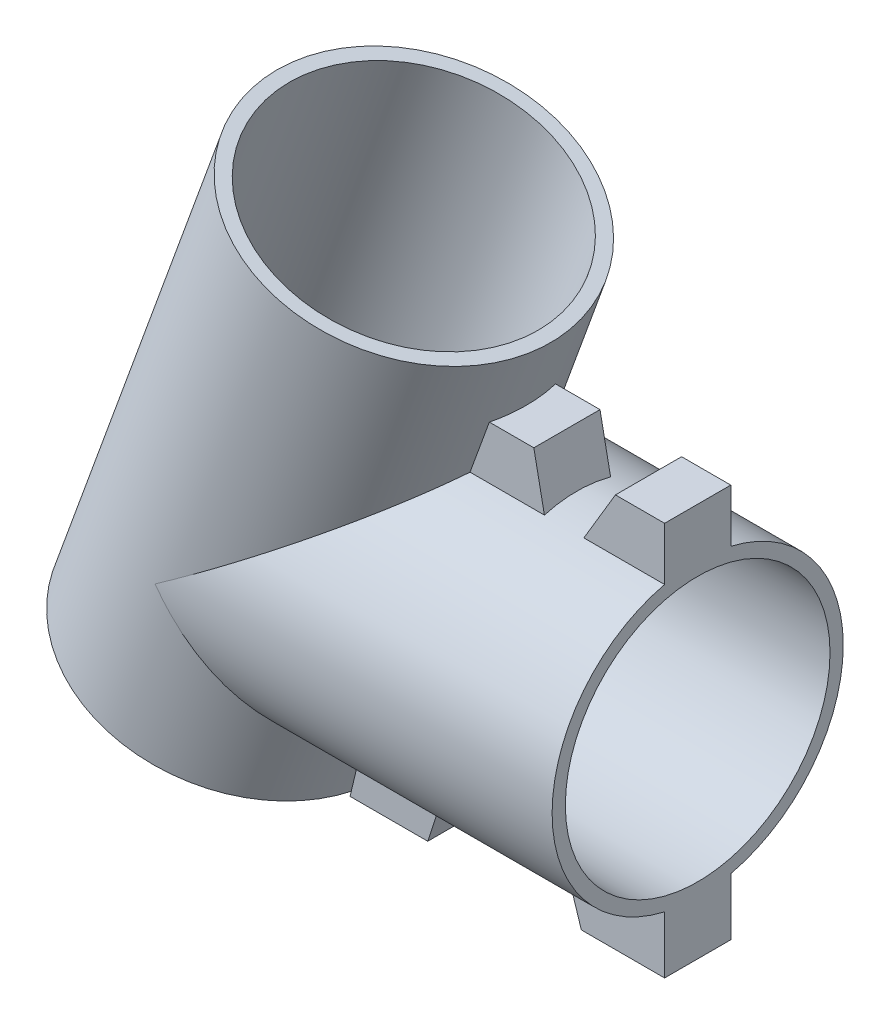
ISO-10303-21;
HEADER;
FILE_DESCRIPTION(('STEP AP214'),'2;1');
FILE_NAME('part.step','',(''),(''),'','','');
FILE_SCHEMA(('AUTOMOTIVE_DESIGN { 1 0 10303 214 1 1 1 1 }'));
ENDSEC;
DATA;
#1=APPLICATION_CONTEXT('core data for automotive mechanical design processes');
#2=APPLICATION_PROTOCOL_DEFINITION('international standard','automotive_design',2000,#1);
#3=PRODUCT_CONTEXT('',#1,'mechanical');
#4=PRODUCT('Part','Part','',(#3));
#5=PRODUCT_RELATED_PRODUCT_CATEGORY('part','',(#4));
#6=PRODUCT_DEFINITION_FORMATION('','',#4);
#7=PRODUCT_DEFINITION_CONTEXT('part definition',#1,'design');
#8=PRODUCT_DEFINITION('design','',#6,#7);
#9=PRODUCT_DEFINITION_SHAPE('','',#8);
#10=(LENGTH_UNIT() NAMED_UNIT(*) SI_UNIT(.MILLI.,.METRE.));
#11=(NAMED_UNIT(*) PLANE_ANGLE_UNIT() SI_UNIT($,.RADIAN.));
#12=(NAMED_UNIT(*) SI_UNIT($,.STERADIAN.) SOLID_ANGLE_UNIT());
#13=UNCERTAINTY_MEASURE_WITH_UNIT(LENGTH_MEASURE(1.E-05),#10,'distance_accuracy_value','');
#14=(GEOMETRIC_REPRESENTATION_CONTEXT(3) GLOBAL_UNCERTAINTY_ASSIGNED_CONTEXT((#13)) GLOBAL_UNIT_ASSIGNED_CONTEXT((#10,
#11,#12)) REPRESENTATION_CONTEXT('',''));
#15=CARTESIAN_POINT('',(0.,0.,0.));
#16=DIRECTION('',(0.,0.,1.));
#17=DIRECTION('',(1.,0.,0.));
#18=AXIS2_PLACEMENT_3D('',#15,#16,#17);
#19=CARTESIAN_POINT('',(30.,0.,0.));
#20=DIRECTION('',(-1.,0.,0.));
#21=DIRECTION('',(0.,0.,1.));
#22=AXIS2_PLACEMENT_3D('',#19,#20,#21);
#23=CYLINDRICAL_SURFACE('',#22,11.);
#24=DIRECTION('',(-1.,0.,0.));
#25=VECTOR('',#24,1.);
#26=CARTESIAN_POINT('',(30.,-10.7121426428143,2.5));
#27=LINE('',#26,#25);
#28=CARTESIAN_POINT('',(13.5093890982505,-10.7121426428143,2.5));
#29=VERTEX_POINT('',#28);
#30=CARTESIAN_POINT('',(7.50072302887626,-10.7121426428143,2.5));
#31=VERTEX_POINT('',#30);
#32=EDGE_CURVE('E58',#29,#31,#27,.T.);
#33=ORIENTED_EDGE('',*,*,#32,.F.);
#34=CARTESIAN_POINT('',(16.9885978400791,0.,0.));
#35=DIRECTION('',(-0.95109245105899,0.308906376655779,0.));
#36=DIRECTION('',(-0.308906376655779,-0.95109245105899,0.));
#37=AXIS2_PLACEMENT_3D('',#34,#35,#36);
#38=ELLIPSE('',#37,11.5656474696567,11.);
#39=CARTESIAN_POINT('',(13.5093890982505,-10.7121426428143,-2.5));
#40=VERTEX_POINT('',#39);
#41=EDGE_CURVE('E44',#40,#29,#38,.T.);
#42=ORIENTED_EDGE('',*,*,#41,.F.);
#43=DIRECTION('',(-1.,0.,0.));
#44=VECTOR('',#43,1.);
#45=CARTESIAN_POINT('',(30.,-10.7121426428143,-2.5));
#46=LINE('',#45,#44);
#47=CARTESIAN_POINT('',(7.50072302887626,-10.7121426428143,-2.5));
#48=VERTEX_POINT('',#47);
#49=EDGE_CURVE('E203',#40,#48,#46,.T.);
#50=ORIENTED_EDGE('',*,*,#49,.T.);
#51=CARTESIAN_POINT('',(0.,0.,0.));
#52=DIRECTION('',(-0.819152044288991,-0.573576436351047,0.));
#53=DIRECTION('',(-0.573576436351047,0.819152044288991,0.));
#54=AXIS2_PLACEMENT_3D('',#51,#52,#53);
#55=ELLIPSE('',#54,13.428520476376,11.);
#56=CARTESIAN_POINT('',(0.,0.,-11.));
#57=VERTEX_POINT('',#56);
#58=EDGE_CURVE('E263',#48,#57,#55,.F.);
#59=ORIENTED_EDGE('',*,*,#58,.T.);
#60=CARTESIAN_POINT('',(0.,0.,0.));
#61=DIRECTION('',(-0.573576436351047,0.819152044288991,0.));
#62=DIRECTION('',(-0.819152044288991,-0.573576436351047,0.));
#63=AXIS2_PLACEMENT_3D('',#60,#61,#62);
#64=ELLIPSE('',#63,19.177914751832,11.);
#65=CARTESIAN_POINT('',(15.2985251632724,10.7121426428143,-2.5));
#66=VERTEX_POINT('',#65);
#67=EDGE_CURVE('E267',#57,#66,#64,.F.);
#68=ORIENTED_EDGE('',*,*,#67,.T.);
#69=DIRECTION('',(-1.,0.,0.));
#70=VECTOR('',#69,1.);
#71=CARTESIAN_POINT('',(30.,10.7121426428143,-2.5));
#72=LINE('',#71,#70);
#73=CARTESIAN_POINT('',(20.9193501262579,10.7121426428143,-2.5));
#74=VERTEX_POINT('',#73);
#75=EDGE_CURVE('E244',#66,#74,#72,.F.);
#76=ORIENTED_EDGE('',*,*,#75,.T.);
#77=CARTESIAN_POINT('',(23.0578554697756,0.,0.));
#78=DIRECTION('',(-0.980649682263221,-0.195770786066369,0.));
#79=DIRECTION('',(-0.195770786066369,0.980649682263221,0.));
#80=AXIS2_PLACEMENT_3D('',#77,#78,#79);
#81=ELLIPSE('',#80,11.2170535502682,11.);
#82=CARTESIAN_POINT('',(20.9193501262579,10.7121426428143,2.5));
#83=VERTEX_POINT('',#82);
#84=EDGE_CURVE('E402',#83,#74,#81,.T.);
#85=ORIENTED_EDGE('',*,*,#84,.F.);
#86=DIRECTION('',(-1.,0.,0.));
#87=VECTOR('',#86,1.);
#88=CARTESIAN_POINT('',(30.,10.7121426428143,2.5));
#89=LINE('',#88,#87);
#90=CARTESIAN_POINT('',(15.2985251632724,10.7121426428143,2.5));
#91=VERTEX_POINT('',#90);
#92=EDGE_CURVE('E247',#91,#83,#89,.F.);
#93=ORIENTED_EDGE('',*,*,#92,.F.);
#94=CARTESIAN_POINT('',(0.,0.,11.));
#95=VERTEX_POINT('',#94);
#96=EDGE_CURVE('E266',#91,#95,#64,.F.);
#97=ORIENTED_EDGE('',*,*,#96,.T.);
#98=EDGE_CURVE('E264',#95,#31,#55,.F.);
#99=ORIENTED_EDGE('',*,*,#98,.T.);
#100=EDGE_LOOP('',(#33,#42,#50,#59,#68,#76,#85,#93,#97,#99));
#101=FACE_BOUND('',#100,.T.);
#102=CARTESIAN_POINT('',(30.,-10.7121426428143,2.5));
#103=VERTEX_POINT('',#102);
#104=CARTESIAN_POINT('',(22.3216688543815,-10.7121426428143,2.5));
#105=VERTEX_POINT('',#104);
#106=EDGE_CURVE('E210',#103,#105,#27,.T.);
#107=ORIENTED_EDGE('',*,*,#106,.F.);
#108=CARTESIAN_POINT('',(30.,0.,0.));
#109=DIRECTION('',(1.,0.,0.));
#110=DIRECTION('',(0.,0.,-1.));
#111=AXIS2_PLACEMENT_3D('',#108,#109,#110);
#112=CIRCLE('',#111,11.);
#113=CARTESIAN_POINT('',(30.,10.7121426428143,2.5));
#114=VERTEX_POINT('',#113);
#115=EDGE_CURVE('E174',#114,#103,#112,.T.);
#116=ORIENTED_EDGE('',*,*,#115,.F.);
#117=CARTESIAN_POINT('',(23.9000041159506,10.7121426428143,2.5));
#118=VERTEX_POINT('',#117);
#119=EDGE_CURVE('E250',#118,#114,#89,.F.);
#120=ORIENTED_EDGE('',*,*,#119,.F.);
#121=CARTESIAN_POINT('',(17.5236119602663,0.,0.));
#122=DIRECTION('',(0.859288767403495,-0.511490776274786,0.));
#123=DIRECTION('',(-0.511490776274786,-0.859288767403495,0.));
#124=AXIS2_PLACEMENT_3D('',#121,#122,#123);
#125=ELLIPSE('',#124,12.8012845242218,11.);
#126=CARTESIAN_POINT('',(23.9000041159506,10.7121426428143,-2.5));
#127=VERTEX_POINT('',#126);
#128=EDGE_CURVE('E592',#127,#118,#125,.T.);
#129=ORIENTED_EDGE('',*,*,#128,.F.);
#130=CARTESIAN_POINT('',(30.,10.7121426428143,-2.5));
#131=VERTEX_POINT('',#130);
#132=EDGE_CURVE('E246',#127,#131,#72,.F.);
#133=ORIENTED_EDGE('',*,*,#132,.T.);
#134=CARTESIAN_POINT('',(30.,-10.7121426428143,-2.5));
#135=VERTEX_POINT('',#134);
#136=EDGE_CURVE('E273',#135,#131,#112,.T.);
#137=ORIENTED_EDGE('',*,*,#136,.F.);
#138=CARTESIAN_POINT('',(22.3216688543815,-10.7121426428143,-2.5));
#139=VERTEX_POINT('',#138);
#140=EDGE_CURVE('E206',#135,#139,#46,.T.);
#141=ORIENTED_EDGE('',*,*,#140,.T.);
#142=CARTESIAN_POINT('',(18.8846964170532,0.,0.));
#143=DIRECTION('',(0.952189405602947,0.305508323712312,0.));
#144=DIRECTION('',(-0.305508323712312,0.952189405602947,0.));
#145=AXIS2_PLACEMENT_3D('',#142,#143,#144);
#146=ELLIPSE('',#145,11.5523234508523,11.);
#147=EDGE_CURVE('E11',#105,#139,#146,.T.);
#148=ORIENTED_EDGE('',*,*,#147,.F.);
#149=EDGE_LOOP('',(#107,#116,#120,#129,#133,#137,#141,#148));
#150=FACE_BOUND('',#149,.T.);
#151=ADVANCED_FACE('F37',(#101,#150),#23,.T.);
#152=CARTESIAN_POINT('',(-4.10424171990799,-11.2763114494309,0.));
#153=DIRECTION('',(0.342020143325666,0.939692620785909,0.));
#154=DIRECTION('',(-0.939692620785909,0.342020143325666,0.));
#155=AXIS2_PLACEMENT_3D('',#152,#153,#154);
#156=CYLINDRICAL_SURFACE('',#155,11.);
#157=CARTESIAN_POINT('',(8.55050358314165,23.4923155196477,0.));
#158=DIRECTION('',(0.342020143325666,0.93969262078591,0.));
#159=DIRECTION('',(-0.939692620785909,0.342020143325666,0.));
#160=AXIS2_PLACEMENT_3D('',#157,#158,#159);
#161=CIRCLE('',#160,11.);
#162=CARTESIAN_POINT('',(-1.78611524550335,27.2545370962301,0.));
#163=VERTEX_POINT('',#162);
#164=EDGE_CURVE('E254',#163,#163,#161,.T.);
#165=ORIENTED_EDGE('',*,*,#164,.F.);
#166=EDGE_LOOP('',(#165));
#167=FACE_BOUND('',#166,.T.);
#168=CARTESIAN_POINT('',(28.7641194466169,79.0287686700761,0.));
#169=DIRECTION('',(0.972491393226406,-0.232938811923996,0.));
#170=DIRECTION('',(0.232938811923996,0.972491393226406,0.));
#171=AXIS2_PLACEMENT_3D('',#168,#169,#170);
#172=ELLIPSE('',#171,96.7281585742419,11.);
#173=CARTESIAN_POINT('',(6.23237710873701,-15.0385330260132,0.));
#174=VERTEX_POINT('',#173);
#175=CARTESIAN_POINT('',(6.82200690893445,-12.5768998565743,2.5));
#176=VERTEX_POINT('',#175);
#177=EDGE_CURVE('E190',#174,#176,#172,.F.);
#178=ORIENTED_EDGE('',*,*,#177,.T.);
#179=DIRECTION('',(0.342020143325666,0.939692620785909,0.));
#180=VECTOR('',#179,1.);
#181=CARTESIAN_POINT('',(5.96187967435065,-14.9400800114512,2.5));
#182=LINE('',#181,#180);
#183=EDGE_CURVE('E207',#176,#31,#182,.T.);
#184=ORIENTED_EDGE('',*,*,#183,.T.);
#185=ORIENTED_EDGE('',*,*,#98,.F.);
#186=ORIENTED_EDGE('',*,*,#96,.F.);
#187=DIRECTION('',(0.342020143325666,0.939692620785909,0.));
#188=VECTOR('',#187,1.);
#189=CARTESIAN_POINT('',(5.96187967435065,-14.9400800114512,2.5));
#190=LINE('',#189,#188);
#191=CARTESIAN_POINT('',(16.7565186227532,14.7179467504503,2.5));
#192=VERTEX_POINT('',#191);
#193=EDGE_CURVE('E594',#91,#192,#190,.T.);
#194=ORIENTED_EDGE('',*,*,#193,.T.);
#195=CARTESIAN_POINT('',(5.35689452667886,14.7179467504503,0.));
#196=DIRECTION('',(0.,-1.,0.));
#197=DIRECTION('',(1.,0.,0.));
#198=AXIS2_PLACEMENT_3D('',#195,#196,#197);
#199=ELLIPSE('',#198,11.705955497235,11.);
#200=CARTESIAN_POINT('',(16.7565186227532,14.7179467504503,-2.5));
#201=VERTEX_POINT('',#200);
#202=EDGE_CURVE('E597',#192,#201,#199,.F.);
#203=ORIENTED_EDGE('',*,*,#202,.T.);
#204=DIRECTION('',(0.342020143325666,0.939692620785909,0.));
#205=VECTOR('',#204,1.);
#206=CARTESIAN_POINT('',(5.96187967435065,-14.9400800114512,-2.5));
#207=LINE('',#206,#205);
#208=EDGE_CURVE('E282',#66,#201,#207,.T.);
#209=ORIENTED_EDGE('',*,*,#208,.F.);
#210=ORIENTED_EDGE('',*,*,#67,.F.);
#211=ORIENTED_EDGE('',*,*,#58,.F.);
#212=DIRECTION('',(0.342020143325666,0.939692620785909,0.));
#213=VECTOR('',#212,1.);
#214=CARTESIAN_POINT('',(5.96187967435065,-14.9400800114512,-2.5));
#215=LINE('',#214,#213);
#216=CARTESIAN_POINT('',(6.82200690893445,-12.5768998565743,-2.5));
#217=VERTEX_POINT('',#216);
#218=EDGE_CURVE('E200',#217,#48,#215,.T.);
#219=ORIENTED_EDGE('',*,*,#218,.F.);
#220=EDGE_CURVE('E193',#217,#174,#172,.F.);
#221=ORIENTED_EDGE('',*,*,#220,.T.);
#222=CARTESIAN_POINT('',(-4.10424171990799,-11.2763114494309,0.));
#223=DIRECTION('',(0.342020143325666,0.93969262078591,0.));
#224=DIRECTION('',(-0.939692620785909,0.342020143325666,0.));
#225=AXIS2_PLACEMENT_3D('',#222,#223,#224);
#226=CIRCLE('',#225,11.);
#227=EDGE_CURVE('E260',#174,#174,#226,.T.);
#228=ORIENTED_EDGE('',*,*,#227,.T.);
#229=EDGE_LOOP('',(#178,#184,#185,#186,#194,#203,#209,#210,#211,#219,#221,#228));
#230=FACE_BOUND('',#229,.T.);
#231=ADVANCED_FACE('F292',(#167,#230),#156,.T.);
#232=CARTESIAN_POINT('',(30.,0.,0.));
#233=DIRECTION('',(1.,0.,0.));
#234=DIRECTION('',(0.,0.,-1.));
#235=AXIS2_PLACEMENT_3D('',#232,#233,#234);
#236=PLANE('',#235);
#237=ORIENTED_EDGE('',*,*,#115,.T.);
#238=DIRECTION('',(0.,1.,0.));
#239=VECTOR('',#238,1.);
#240=CARTESIAN_POINT('',(30.,-15.0385330260132,2.5));
#241=LINE('',#240,#239);
#242=CARTESIAN_POINT('',(30.,-15.0385330260132,2.5));
#243=VERTEX_POINT('',#242);
#244=EDGE_CURVE('E164',#243,#103,#241,.T.);
#245=ORIENTED_EDGE('',*,*,#244,.F.);
#246=DIRECTION('',(0.,0.,-1.));
#247=VECTOR('',#246,1.);
#248=CARTESIAN_POINT('',(30.,-15.0385330260132,2.5));
#249=LINE('',#248,#247);
#250=CARTESIAN_POINT('',(30.,-15.0385330260132,-2.5));
#251=VERTEX_POINT('',#250);
#252=EDGE_CURVE('E170',#243,#251,#249,.T.);
#253=ORIENTED_EDGE('',*,*,#252,.T.);
#254=DIRECTION('',(0.,1.,0.));
#255=VECTOR('',#254,1.);
#256=CARTESIAN_POINT('',(30.,-15.0385330260132,-2.5));
#257=LINE('',#256,#255);
#258=EDGE_CURVE('E379',#251,#135,#257,.T.);
#259=ORIENTED_EDGE('',*,*,#258,.T.);
#260=ORIENTED_EDGE('',*,*,#136,.T.);
#261=DIRECTION('',(0.,1.,0.));
#262=VECTOR('',#261,1.);
#263=CARTESIAN_POINT('',(30.,10.2376867624351,-2.5));
#264=LINE('',#263,#262);
#265=CARTESIAN_POINT('',(30.,14.7179467504503,-2.5));
#266=VERTEX_POINT('',#265);
#267=EDGE_CURVE('E228',#131,#266,#264,.T.);
#268=ORIENTED_EDGE('',*,*,#267,.T.);
#269=DIRECTION('',(0.,0.,-1.));
#270=VECTOR('',#269,1.);
#271=CARTESIAN_POINT('',(30.,14.7179467504503,2.5));
#272=LINE('',#271,#270);
#273=CARTESIAN_POINT('',(30.,14.7179467504503,2.5));
#274=VERTEX_POINT('',#273);
#275=EDGE_CURVE('E241',#274,#266,#272,.T.);
#276=ORIENTED_EDGE('',*,*,#275,.F.);
#277=DIRECTION('',(0.,1.,0.));
#278=VECTOR('',#277,1.);
#279=CARTESIAN_POINT('',(30.,10.2376867624351,2.5));
#280=LINE('',#279,#278);
#281=EDGE_CURVE('E214',#114,#274,#280,.T.);
#282=ORIENTED_EDGE('',*,*,#281,.F.);
#283=EDGE_LOOP('',(#237,#245,#253,#259,#260,#268,#276,#282));
#284=FACE_BOUND('',#283,.T.);
#285=CARTESIAN_POINT('',(30.,0.,0.));
#286=DIRECTION('',(1.,0.,0.));
#287=DIRECTION('',(0.,0.,-1.));
#288=AXIS2_PLACEMENT_3D('',#285,#286,#287);
#289=CIRCLE('',#288,10.);
#290=CARTESIAN_POINT('',(30.,0.,-10.));
#291=VERTEX_POINT('',#290);
#292=EDGE_CURVE('E270',#291,#291,#289,.T.);
#293=ORIENTED_EDGE('',*,*,#292,.F.);
#294=EDGE_LOOP('',(#293));
#295=FACE_BOUND('',#294,.T.);
#296=ADVANCED_FACE('F166',(#284,#295),#236,.T.);
#297=CARTESIAN_POINT('',(30.,0.,0.));
#298=DIRECTION('',(-1.,0.,0.));
#299=DIRECTION('',(0.,0.,1.));
#300=AXIS2_PLACEMENT_3D('',#297,#298,#299);
#301=CYLINDRICAL_SURFACE('',#300,10.);
#302=CARTESIAN_POINT('',(4.87667519526036,0.,10.));
#303=CARTESIAN_POINT('',(4.83316749520878,-0.119543414479836,9.99999944236174));
#304=CARTESIAN_POINT('',(4.79405552958466,-0.240720496418783,9.99785325621343));
#305=CARTESIAN_POINT('',(4.7255083582746,-0.485622488901579,9.98895303871183));
#306=CARTESIAN_POINT('',(4.69607332214629,-0.6093474440485,9.98219892662556));
#307=CARTESIAN_POINT('',(4.64731589580286,-0.858508946869633,9.96386328162467));
#308=CARTESIAN_POINT('',(4.6279998645241,-0.983946520105342,9.95227872137442));
#309=CARTESIAN_POINT('',(4.59945419885167,-1.2354005000026,9.92420232544032));
#310=CARTESIAN_POINT('',(4.5902240350544,-1.3614168759343,9.90771074738191));
#311=CARTESIAN_POINT('',(4.58132682447828,-1.61221249391166,9.86999207908324));
#312=CARTESIAN_POINT('',(4.58159724826965,-1.73699442007543,9.84879686450751));
#313=CARTESIAN_POINT('',(4.59065297721359,-1.98538338619193,9.80174774597156));
#314=CARTESIAN_POINT('',(4.5994418555438,-2.10898991113552,9.77589189074931));
#315=CARTESIAN_POINT('',(4.63699999950057,-2.47733167826657,9.69155398531685));
#316=CARTESIAN_POINT('',(4.67696391813376,-2.71942310984607,9.62632673572664));
#317=CARTESIAN_POINT('',(4.77484148476767,-3.17915494608304,9.48406272461954));
#318=CARTESIAN_POINT('',(4.83150628385426,-3.39738486862002,9.40799356721854));
#319=CARTESIAN_POINT('',(4.95753485645188,-3.82502630582167,9.24238918508279));
#320=CARTESIAN_POINT('',(5.02690876790143,-4.03443061516813,9.1528432202769));
#321=CARTESIAN_POINT('',(5.17412555509535,-4.44485414053646,8.96073540410827));
#322=CARTESIAN_POINT('',(5.25199285618755,-4.6458467437159,8.85813586445524));
#323=CARTESIAN_POINT('',(5.41273305845969,-5.03887158783448,8.64061354355422));
#324=CARTESIAN_POINT('',(5.4956051171295,-5.23090532733102,8.52569283396324));
#325=CARTESIAN_POINT('',(5.69229705549218,-5.66940422313144,8.2429962067872));
#326=CARTESIAN_POINT('',(5.8071239301561,-5.91237140751139,8.07047011216848));
#327=CARTESIAN_POINT('',(6.03688835867747,-6.38200235877704,7.70445853136223));
#328=CARTESIAN_POINT('',(6.15182593433127,-6.6086616088184,7.51096727531109));
#329=CARTESIAN_POINT('',(6.37831302574934,-7.04454779267764,7.10374699178558));
#330=CARTESIAN_POINT('',(6.48986482680862,-7.25378665883785,6.89003203481585));
#331=CARTESIAN_POINT('',(6.70681682006805,-7.65363386246784,6.44296513052916));
#332=CARTESIAN_POINT('',(6.81221771817163,-7.84424433951038,6.20961544411146));
#333=CARTESIAN_POINT('',(7.01414578594415,-8.20473610696584,5.72479812633705));
#334=CARTESIAN_POINT('',(7.11069433710864,-8.37466768769844,5.47337691555381));
#335=CARTESIAN_POINT('',(7.29297208871077,-8.69245781893609,4.95318660937712));
#336=CARTESIAN_POINT('',(7.37870079218014,-8.84031535561145,4.68441671799481));
#337=CARTESIAN_POINT('',(7.53720384608787,-9.1118010531444,4.13156402987184));
#338=CARTESIAN_POINT('',(7.60999030247181,-9.23545186758723,3.8474958704395));
#339=CARTESIAN_POINT('',(7.74086070798402,-9.45669231671084,3.26613511635948));
#340=CARTESIAN_POINT('',(7.79894769906281,-9.55428734368313,2.96884527284264));
#341=CARTESIAN_POINT('',(7.89195221910182,-9.71004578548007,2.4058502110774));
#342=CARTESIAN_POINT('',(7.92896532000317,-9.77179985858523,2.14147924834269));
#343=CARTESIAN_POINT('',(7.99018006804206,-9.87375303971008,1.60715401269033));
#344=CARTESIAN_POINT('',(8.01438296638424,-9.91395425285663,1.33720028773227));
#345=CARTESIAN_POINT('',(8.04944501661138,-9.97214827367639,0.794213875138749));
#346=CARTESIAN_POINT('',(8.06031219586332,-9.9901544415712,0.521183139689972));
#347=CARTESIAN_POINT('',(8.06848887230162,-10.0037053435342,-0.0256320364093605));
#348=CARTESIAN_POINT('',(8.06579930847051,-9.99925163324388,-0.299416423546852));
#349=CARTESIAN_POINT('',(8.04795281287952,-9.96966413626494,-0.81560595936874));
#350=CARTESIAN_POINT('',(8.0341792002112,-9.94682482229167,-1.05819495617296));
#351=CARTESIAN_POINT('',(7.9961513081791,-9.88365843105345,-1.54025341526282));
#352=CARTESIAN_POINT('',(7.97189712958732,-9.84333152193398,-1.7797229075201));
#353=CARTESIAN_POINT('',(7.91332265996645,-9.74569503926927,-2.25389065694767));
#354=CARTESIAN_POINT('',(7.87900309212334,-9.68838668581713,-2.48858925560586));
#355=CARTESIAN_POINT('',(7.80086114211625,-9.55745728580428,-2.95176825290875));
#356=CARTESIAN_POINT('',(7.75703838781745,-9.48383560042812,-3.18024840765125));
#357=CARTESIAN_POINT('',(7.65992089752519,-9.31996283219667,-3.63276673495536));
#358=CARTESIAN_POINT('',(7.6065045717119,-9.22949765850341,-3.85670110581493));
#359=CARTESIAN_POINT('',(7.4914468915715,-9.0335407528586,-4.29568676432234));
#360=CARTESIAN_POINT('',(7.42980554163199,-8.92804902892291,-4.51073805670874));
#361=CARTESIAN_POINT('',(7.29921857788456,-8.70299709890104,-4.93098914051781));
#362=CARTESIAN_POINT('',(7.23027373548979,-8.58343837845891,-5.13618996905079));
#363=CARTESIAN_POINT('',(7.08603258768695,-8.33112825795807,-5.53608418033447));
#364=CARTESIAN_POINT('',(7.01073354719623,-8.19837117240866,-5.73077297858102));
#365=CARTESIAN_POINT('',(6.8461468477476,-7.90505624262527,-6.13010023039348));
#366=CARTESIAN_POINT('',(6.75623636897276,-7.74304958798562,-6.33341845518862));
#367=CARTESIAN_POINT('',(6.57149645177471,-7.4050242784705,-6.72551940879143));
#368=CARTESIAN_POINT('',(6.47666834381044,-7.22900940668271,-6.91430603512141));
#369=CARTESIAN_POINT('',(6.28366627654224,-6.86357768876705,-7.27720513115459));
#370=CARTESIAN_POINT('',(6.18548756159111,-6.67414134493503,-7.45129541243314));
#371=CARTESIAN_POINT('',(5.98793962344832,-6.28282842676995,-7.78408887335719));
#372=CARTESIAN_POINT('',(5.88857052457928,-6.08095314257933,-7.9427936443785));
#373=CARTESIAN_POINT('',(5.69625867532129,-5.676111946313,-8.23656362901949));
#374=CARTESIAN_POINT('',(5.60325229752454,-5.47375898651227,-8.37243226240736));
#375=CARTESIAN_POINT('',(5.42097048323743,-5.05837041569198,-8.62975142880545));
#376=CARTESIAN_POINT('',(5.33169606823839,-4.84533191453726,-8.75119803082853));
#377=CARTESIAN_POINT('',(5.16055270777289,-4.40889815735382,-8.97898036652645));
#378=CARTESIAN_POINT('',(5.07867188794658,-4.18552041199389,-9.08534049229919));
#379=CARTESIAN_POINT('',(4.92704628297102,-3.72816437743075,-9.28239189368151));
#380=CARTESIAN_POINT('',(4.85729203292856,-3.49419453687474,-9.37309538903134));
#381=CARTESIAN_POINT('',(4.7309425334066,-2.99324962864942,-9.54550862040833));
#382=CARTESIAN_POINT('',(4.67615795659224,-2.72522215640284,-9.6256136837959));
#383=CARTESIAN_POINT('',(4.61962558525415,-2.31576935558073,-9.72918467650099));
#384=CARTESIAN_POINT('',(4.60505706637309,-2.17817002626169,-9.76092393671849));
#385=CARTESIAN_POINT('',(4.58601123278741,-1.90110753584195,-9.81864435796924));
#386=CARTESIAN_POINT('',(4.58152830027639,-1.76164545589105,-9.84462871728319));
#387=CARTESIAN_POINT('',(4.58405347343605,-1.47981389346111,-9.89094690840658));
#388=CARTESIAN_POINT('',(4.59122635518891,-1.33743131091165,-9.91119487858017));
#389=CARTESIAN_POINT('',(4.61834788437797,-1.05312714367192,-9.94542190971155));
#390=CARTESIAN_POINT('',(4.63829496450486,-0.911205504573671,-9.95940173937085));
#391=CARTESIAN_POINT('',(4.69116888951949,-0.629321295230561,-9.98117942515595));
#392=CARTESIAN_POINT('',(4.72409572849692,-0.489358724093676,-9.98897728409668));
#393=CARTESIAN_POINT('',(4.80229302018354,-0.212721790754963,-9.99869599120282));
#394=CARTESIAN_POINT('',(4.84756560179126,-0.0760480000976094,-10.0006158250634));
#395=CARTESIAN_POINT('',(4.95665582866065,0.212891047178269,-9.99892588973534));
#396=CARTESIAN_POINT('',(5.02222290803176,0.364487293132292,-9.99445990968539));
#397=CARTESIAN_POINT('',(5.16550840372863,0.661562345631603,-9.97920330471339));
#398=CARTESIAN_POINT('',(5.24323714476361,0.807035819818395,-9.96840728427483));
#399=CARTESIAN_POINT('',(5.40865203595864,1.09230734447774,-9.94120084473515));
#400=CARTESIAN_POINT('',(5.49637332945504,1.23208286038709,-9.92477017456132));
#401=CARTESIAN_POINT('',(5.67937410834876,1.50580322593928,-9.88694302210723));
#402=CARTESIAN_POINT('',(5.77465213680344,1.63974919184712,-9.8655474955295));
#403=CARTESIAN_POINT('',(5.97570503174987,1.9086822884318,-9.81715238984137));
#404=CARTESIAN_POINT('',(6.08176352481137,2.04341667651181,-9.78993489729165));
#405=CARTESIAN_POINT('',(6.29875011243021,2.30790262344876,-9.73097748771188));
#406=CARTESIAN_POINT('',(6.40967945335468,2.43765289084213,-9.69923640845183));
#407=CARTESIAN_POINT('',(6.74808140212022,2.82060507698499,-9.5976123753541));
#408=CARTESIAN_POINT('',(6.98101219085067,3.0673072141227,-9.52136611154372));
#409=CARTESIAN_POINT('',(7.45516384002089,3.54778596906169,-9.35296942567859));
#410=CARTESIAN_POINT('',(7.69640098464392,3.78153454183,-9.26078614938611));
#411=CARTESIAN_POINT('',(8.18252645749105,4.23808875716584,-9.06093981172418));
#412=CARTESIAN_POINT('',(8.42741304698861,4.4608994065522,-8.9532839232546));
#413=CARTESIAN_POINT('',(8.96718928925182,4.94102048710153,-8.69909171685653));
#414=CARTESIAN_POINT('',(9.26226277597546,5.19629417837842,-8.5490874244721));
#415=CARTESIAN_POINT('',(9.8497154559586,5.69488036991346,-8.22536687170632));
#416=CARTESIAN_POINT('',(10.14209375185,5.93818899551647,-8.05164299808283));
#417=CARTESIAN_POINT('',(10.7198008405999,6.41227528210822,-7.67941013367518));
#418=CARTESIAN_POINT('',(11.0051446778921,6.64308123340612,-7.48096076615318));
#419=CARTESIAN_POINT('',(11.5656519306014,7.09178312013525,-7.05704120161539));
#420=CARTESIAN_POINT('',(11.840820155028,7.30968518401922,-6.83158398777282));
#421=CARTESIAN_POINT('',(12.2796244735424,7.65446010882893,-6.43822249147821));
#422=CARTESIAN_POINT('',(12.4475992582308,7.78574844099611,-6.27900089127535));
#423=CARTESIAN_POINT('',(12.7762261625311,8.04151213691162,-5.94792932866374));
#424=CARTESIAN_POINT('',(12.9368776640329,8.16598692575109,-5.77607830347443));
#425=CARTESIAN_POINT('',(13.2491283816388,8.40706367133549,-5.41918828278914));
#426=CARTESIAN_POINT('',(13.4007308949242,8.52366849770965,-5.23415414540337));
#427=CARTESIAN_POINT('',(13.6928995805963,8.74772522558319,-4.85043602189471));
#428=CARTESIAN_POINT('',(13.8334668372628,8.85517802641186,-4.65175338042449));
#429=CARTESIAN_POINT('',(14.1852239632876,9.12341610190527,-4.11127136817832));
#430=CARTESIAN_POINT('',(14.3856084914247,9.27553315001567,-3.75766989504469));
#431=CARTESIAN_POINT('',(14.6503129510834,9.47595830488703,-3.20080775379805));
#432=CARTESIAN_POINT('',(14.7325505932145,9.53812775885735,-3.01083535115246));
#433=CARTESIAN_POINT('',(14.8834909694977,9.65210964714241,-2.62252850449044));
#434=CARTESIAN_POINT('',(14.9521967388223,9.70392440403379,-2.42419594778418));
#435=CARTESIAN_POINT('',(15.0629387199209,9.78737266132424,-2.05808365175209));
#436=CARTESIAN_POINT('',(15.1075596133591,9.82096818475322,-1.8915281155124));
#437=CARTESIAN_POINT('',(15.1859047767356,9.87992549853529,-1.55445332490069));
#438=CARTESIAN_POINT('',(15.2196312944428,9.90528898735818,-1.38393489596044));
#439=CARTESIAN_POINT('',(15.2754832282924,9.94727802333859,-1.04002532089557));
#440=CARTESIAN_POINT('',(15.2976144664266,9.96390795562618,-0.866635661619473));
#441=CARTESIAN_POINT('',(15.3298102247209,9.98809710860044,-0.518100384358603));
#442=CARTESIAN_POINT('',(15.3398745883862,9.99565621164785,-0.34295474363028));
#443=CARTESIAN_POINT('',(15.3477088352832,10.0015405163899,0.008106820130757));
#444=CARTESIAN_POINT('',(15.345454952822,9.99984786860539,0.184023577407228));
#445=CARTESIAN_POINT('',(15.3286509095553,9.98722554278422,0.534931530889286));
#446=CARTESIAN_POINT('',(15.3141007204439,9.97629584348393,0.709922724963302));
#447=CARTESIAN_POINT('',(15.2730317865794,9.94543420506603,1.05775142912856));
#448=CARTESIAN_POINT('',(15.2465083804163,9.92549875983123,1.23058807345472));
#449=CARTESIAN_POINT('',(15.1820708440584,9.87703949666778,1.57288809021295));
#450=CARTESIAN_POINT('',(15.1441564907292,9.84851551050031,1.74235139649621));
#451=CARTESIAN_POINT('',(15.0583804613713,9.78393691916484,2.07429881294971));
#452=CARTESIAN_POINT('',(15.010685760339,9.74800867751359,2.23685093932359));
#453=CARTESIAN_POINT('',(14.9058203802335,9.66894416594274,2.55709756787009));
#454=CARTESIAN_POINT('',(14.848646731226,9.62580563686868,2.71479052915244));
#455=CARTESIAN_POINT('',(14.6642533647527,9.48653138231328,3.1796672724006));
#456=CARTESIAN_POINT('',(14.5241159031831,9.38050294102146,3.47881870048765));
#457=CARTESIAN_POINT('',(14.1192069098192,9.07324800893154,4.23464726015562));
#458=CARTESIAN_POINT('',(13.8315455795815,8.85413616825295,4.6717939203937));
#459=CARTESIAN_POINT('',(13.3637007640856,8.49522161577749,5.28082347537844));
#460=CARTESIAN_POINT('',(13.2013383760301,8.37026659974455,5.4763898954931));
#461=CARTESIAN_POINT('',(12.8666154543196,8.11159785739306,5.85269409335084));
#462=CARTESIAN_POINT('',(12.6942554904108,7.97788463013509,6.0334327146922));
#463=CARTESIAN_POINT('',(12.2372041896884,7.62157501691794,6.48352227999656));
#464=CARTESIAN_POINT('',(11.9463738589218,7.39318758090936,6.74205055624986));
#465=CARTESIAN_POINT('',(11.3506681281439,6.92047478413708,7.22645221762589));
#466=CARTESIAN_POINT('',(11.0457832364585,6.67613860474007,7.45230309526353));
#467=CARTESIAN_POINT('',(10.4270043989898,6.17320951189647,7.87395714616976));
#468=CARTESIAN_POINT('',(10.11310713274,5.91461131066332,8.06974907159387));
#469=CARTESIAN_POINT('',(9.48102074175638,5.38365384160945,8.43325685164688));
#470=CARTESIAN_POINT('',(9.16283340535036,5.11130018525229,8.60098403660677));
#471=CARTESIAN_POINT('',(8.63141816603544,4.64351925355538,8.85910247515083));
#472=CARTESIAN_POINT('',(8.41805995887899,4.45222426468383,8.95679479868734));
#473=CARTESIAN_POINT('',(7.9933298426824,4.06194997271346,9.14041042985557));
#474=CARTESIAN_POINT('',(7.78195769702741,3.86297159980627,9.2263351564445));
#475=CARTESIAN_POINT('',(7.36333345957219,3.45576394619375,9.38645910087581));
#476=CARTESIAN_POINT('',(7.15608496577791,3.24752705900618,9.46064844045056));
#477=CARTESIAN_POINT('',(6.74922496150076,2.8199085116925,9.59679696939075));
#478=CARTESIAN_POINT('',(6.54961041820532,2.60053135971962,9.65876105715748));
#479=CARTESIAN_POINT('',(6.22914791884782,2.22503107812228,9.75052421483848));
#480=CARTESIAN_POINT('',(6.1046943449476,2.07291151769798,9.78407883306441));
#481=CARTESIAN_POINT('',(5.86337148089749,1.76140841020339,9.84493007508952));
#482=CARTESIAN_POINT('',(5.7465048082644,1.60202238811423,9.87222454724868));
#483=CARTESIAN_POINT('',(5.52388364310511,1.27592906364619,9.91962721645096));
#484=CARTESIAN_POINT('',(5.41806970229136,1.10926858307702,9.93977542229037));
#485=CARTESIAN_POINT('',(5.2205435511748,0.767132277010927,9.97200802356436));
#486=CARTESIAN_POINT('',(5.12881295752914,0.591668346977614,9.98410300113305));
#487=CARTESIAN_POINT('',(5.01528050083232,0.344455011763232,9.99429350057664));
#488=CARTESIAN_POINT('',(4.98560885919395,0.27643345157393,9.99641399614904));
#489=CARTESIAN_POINT('',(4.92901413354564,0.13912809796,9.99926825320669));
#490=CARTESIAN_POINT('',(4.90209443462108,0.0698428706426366,10.0000003257984));
#491=CARTESIAN_POINT('',(4.87667519526036,0.,10.));
#492=B_SPLINE_CURVE_WITH_KNOTS('',3,(#302,#303,#304,#305,#306,#307,#308,#309,#310,#311,#312,
#313,#314,#315,#316,#317,#318,#319,#320,#321,#322,#323,#324,#325,#326,#327,#328,#329,#330,#331,
#332,#333,#334,#335,#336,#337,#338,#339,#340,#341,#342,#343,#344,#345,#346,#347,#348,#349,#350,
#351,#352,#353,#354,#355,#356,#357,#358,#359,#360,#361,#362,#363,#364,#365,#366,#367,#368,#369,
#370,#371,#372,#373,#374,#375,#376,#377,#378,#379,#380,#381,#382,#383,#384,#385,#386,#387,#388,
#389,#390,#391,#392,#393,#394,#395,#396,#397,#398,#399,#400,#401,#402,#403,#404,#405,#406,#407,
#408,#409,#410,#411,#412,#413,#414,#415,#416,#417,#418,#419,#420,#421,#422,#423,#424,#425,#426,
#427,#428,#429,#430,#431,#432,#433,#434,#435,#436,#437,#438,#439,#440,#441,#442,#443,#444,#445,
#446,#447,#448,#449,#450,#451,#452,#453,#454,#455,#456,#457,#458,#459,#460,#461,#462,#463,#464,
#465,#466,#467,#468,#469,#470,#471,#472,#473,#474,#475,#476,#477,#478,#479,#480,#481,#482,#483,
#484,#485,#486,#487,#488,#489,#490,#491),.UNSPECIFIED.,.T.,.F.,(4,2,2,2,2,2,2,2,2,2,2,2,2,2,2,2,
2,2,2,2,2,2,2,2,2,2,2,2,2,2,2,2,2,2,2,2,2,2,2,2,2,2,2,2,2,2,2,2,2,2,2,2,2,2,2,2,2,2,2,2,2,2,2,2,
2,2,2,2,2,2,2,2,2,2,2,2,2,2,2,2,2,2,2,2,2,2,2,2,2,2,2,2,2,2,4),(0.,0.381575987037004,
0.763158659631908,1.1449808377931,1.52678297328069,1.90607269896645,2.28552159159419,
3.04491831692493,3.7578185855549,4.47129002391926,5.18687024252985,5.90233033303299,
6.85920806867444,7.81634982065607,8.77283047633678,9.7292011455368,10.6831973920509,
11.637237440795,12.5903803485819,13.5433258485766,14.3641751311275,15.1849442244679,
16.0052190173783,16.8254369962659,17.5567274750618,18.2880109225612,19.0192418411,
19.750501399048,20.4917835242402,21.2330652539992,21.9742687656449,22.7157929622507,
23.5402005326896,24.3643862125575,25.1897947794602,26.0151178802455,26.7971383527069,
27.5793714921999,28.3603251232338,29.1406664495121,29.9930884251782,30.4185760688466,
30.8438266514707,31.2751413910028,31.7064032212166,32.1376648550565,32.5690009026837,
33.063875944536,33.5591734159301,34.0562699859302,34.5532709473363,35.0738787030817,
35.5946204587856,36.6368728703418,37.6813000852148,38.7252446698224,39.9784411700072,
41.2320408567324,42.4826740773713,43.7327084899686,44.530561501313,45.3284817299509,
46.1261094227964,46.9236586456305,48.2199445991058,48.8677159574458,49.5153418560541,
50.0418307090798,50.5682108654397,51.0943264723417,51.620448902344,52.1475867425352,
52.6747257961961,53.2020702527459,53.7294250399883,54.2484314242935,54.7676007315301,
55.805407479929,57.4972143687157,58.3464645416648,59.1956663646505,60.547180754359,
61.8996216510779,63.2525673944453,64.6049656000723,65.5129378904229,66.4208005993228,
67.3294234815391,68.2376815549915,68.8355539368867,69.4336315032596,70.0283057839092,
70.6221970980694,70.8448610121839,71.0677956039297),.UNSPECIFIED.);
#493=CARTESIAN_POINT('',(4.87667519526036,0.,10.));
#494=VERTEX_POINT('',#493);
#495=EDGE_CURVE('E275',#494,#494,#492,.T.);
#496=ORIENTED_EDGE('',*,*,#495,.F.);
#497=EDGE_LOOP('',(#496));
#498=FACE_BOUND('',#497,.T.);
#499=ORIENTED_EDGE('',*,*,#292,.T.);
#500=EDGE_LOOP('',(#499));
#501=FACE_BOUND('',#500,.T.);
#502=ADVANCED_FACE('F284',(#498,#501),#301,.F.);
#503=ORIENTED_EDGE('',*,*,#495,.T.);
#504=EDGE_LOOP('',(#503));
#505=FACE_BOUND('',#504,.T.);
#506=ADVANCED_FACE('F286',(#505),#156,.T.);
#507=CARTESIAN_POINT('',(-4.10424171990799,-11.2763114494309,0.));
#508=DIRECTION('',(0.342020143325666,0.939692620785909,0.));
#509=DIRECTION('',(-0.939692620785909,0.342020143325666,0.));
#510=AXIS2_PLACEMENT_3D('',#507,#508,#509);
#511=CYLINDRICAL_SURFACE('',#510,10.);
#512=CARTESIAN_POINT('',(-4.10424171990799,-11.2763114494309,0.));
#513=DIRECTION('',(0.342020143325666,0.93969262078591,0.));
#514=DIRECTION('',(-0.939692620785909,0.342020143325666,0.));
#515=AXIS2_PLACEMENT_3D('',#512,#513,#514);
#516=CIRCLE('',#515,10.);
#517=CARTESIAN_POINT('',(-13.5011679277671,-7.85611001617425,0.));
#518=VERTEX_POINT('',#517);
#519=EDGE_CURVE('E257',#518,#518,#516,.T.);
#520=ORIENTED_EDGE('',*,*,#519,.F.);
#521=EDGE_LOOP('',(#520));
#522=FACE_BOUND('',#521,.T.);
#523=CARTESIAN_POINT('',(8.55050358314165,23.4923155196477,0.));
#524=DIRECTION('',(0.342020143325666,0.93969262078591,0.));
#525=DIRECTION('',(-0.939692620785909,0.342020143325666,0.));
#526=AXIS2_PLACEMENT_3D('',#523,#524,#525);
#527=CIRCLE('',#526,10.);
#528=CARTESIAN_POINT('',(-0.846422624717439,26.9125169529044,0.));
#529=VERTEX_POINT('',#528);
#530=EDGE_CURVE('E251',#529,#529,#527,.T.);
#531=ORIENTED_EDGE('',*,*,#530,.T.);
#532=EDGE_LOOP('',(#531));
#533=FACE_BOUND('',#532,.T.);
#534=ADVANCED_FACE('F290',(#522,#533),#511,.F.);
#535=CARTESIAN_POINT('',(-4.10424171990799,-11.2763114494309,0.));
#536=DIRECTION('',(0.342020143325666,0.93969262078591,0.));
#537=DIRECTION('',(-0.939692620785909,0.342020143325666,0.));
#538=AXIS2_PLACEMENT_3D('',#535,#536,#537);
#539=PLANE('',#538);
#540=ORIENTED_EDGE('',*,*,#519,.T.);
#541=EDGE_LOOP('',(#540));
#542=FACE_BOUND('',#541,.T.);
#543=ORIENTED_EDGE('',*,*,#227,.F.);
#544=EDGE_LOOP('',(#543));
#545=FACE_BOUND('',#544,.T.);
#546=ADVANCED_FACE('F293',(#542,#545),#539,.F.);
#547=CARTESIAN_POINT('',(8.55050358314165,23.4923155196477,0.));
#548=DIRECTION('',(0.342020143325666,0.93969262078591,0.));
#549=DIRECTION('',(-0.939692620785909,0.342020143325666,0.));
#550=AXIS2_PLACEMENT_3D('',#547,#548,#549);
#551=PLANE('',#550);
#552=ORIENTED_EDGE('',*,*,#164,.T.);
#553=EDGE_LOOP('',(#552));
#554=FACE_BOUND('',#553,.T.);
#555=ORIENTED_EDGE('',*,*,#530,.F.);
#556=EDGE_LOOP('',(#555));
#557=FACE_BOUND('',#556,.T.);
#558=ADVANCED_FACE('F296',(#554,#557),#551,.T.);
#559=CARTESIAN_POINT('',(0.,0.,-2.5));
#560=DIRECTION('',(0.,0.,-1.));
#561=DIRECTION('',(-1.,0.,0.));
#562=AXIS2_PLACEMENT_3D('',#559,#560,#561);
#563=PLANE('',#562);
#564=ORIENTED_EDGE('',*,*,#75,.F.);
#565=ORIENTED_EDGE('',*,*,#208,.T.);
#566=DIRECTION('',(-1.,0.,0.));
#567=VECTOR('',#566,1.);
#568=CARTESIAN_POINT('',(20.11965637918,14.7179467504503,-2.5));
#569=LINE('',#568,#567);
#570=CARTESIAN_POINT('',(20.11965637918,14.7179467504503,-2.5));
#571=VERTEX_POINT('',#570);
#572=EDGE_CURVE('E225',#571,#201,#569,.T.);
#573=ORIENTED_EDGE('',*,*,#572,.F.);
#574=DIRECTION('',(-0.195770786066369,0.980649682263221,0.));
#575=VECTOR('',#574,1.);
#576=CARTESIAN_POINT('',(20.11965637918,14.7179467504503,-2.5));
#577=LINE('',#576,#575);
#578=EDGE_CURVE('E215',#74,#571,#577,.T.);
#579=ORIENTED_EDGE('',*,*,#578,.F.);
#580=EDGE_LOOP('',(#564,#565,#573,#579));
#581=FACE_BOUND('',#580,.T.);
#582=ADVANCED_FACE('F303',(#581),#563,.T.);
#583=CARTESIAN_POINT('',(0.,0.,2.5));
#584=DIRECTION('',(0.,0.,-1.));
#585=DIRECTION('',(-1.,0.,0.));
#586=AXIS2_PLACEMENT_3D('',#583,#584,#585);
#587=PLANE('',#586);
#588=ORIENTED_EDGE('',*,*,#193,.F.);
#589=ORIENTED_EDGE('',*,*,#92,.T.);
#590=DIRECTION('',(-0.195770786066369,0.980649682263221,0.));
#591=VECTOR('',#590,1.);
#592=CARTESIAN_POINT('',(20.11965637918,14.7179467504503,2.5));
#593=LINE('',#592,#591);
#594=CARTESIAN_POINT('',(20.11965637918,14.7179467504503,2.5));
#595=VERTEX_POINT('',#594);
#596=EDGE_CURVE('E222',#83,#595,#593,.T.);
#597=ORIENTED_EDGE('',*,*,#596,.T.);
#598=DIRECTION('',(-1.,0.,0.));
#599=VECTOR('',#598,1.);
#600=CARTESIAN_POINT('',(20.11965637918,14.7179467504503,2.5));
#601=LINE('',#600,#599);
#602=EDGE_CURVE('E211',#595,#192,#601,.T.);
#603=ORIENTED_EDGE('',*,*,#602,.T.);
#604=EDGE_LOOP('',(#588,#589,#597,#603));
#605=FACE_BOUND('',#604,.T.);
#606=ADVANCED_FACE('F309',(#605),#587,.F.);
#607=CARTESIAN_POINT('',(20.11965637918,14.7179467504503,2.5));
#608=DIRECTION('',(0.,-1.,0.));
#609=DIRECTION('',(0.,0.,-1.));
#610=AXIS2_PLACEMENT_3D('',#607,#608,#609);
#611=PLANE('',#610);
#612=ORIENTED_EDGE('',*,*,#202,.F.);
#613=ORIENTED_EDGE('',*,*,#602,.F.);
#614=DIRECTION('',(0.,0.,-1.));
#615=VECTOR('',#614,1.);
#616=CARTESIAN_POINT('',(20.11965637918,14.7179467504503,2.5));
#617=LINE('',#616,#615);
#618=EDGE_CURVE('E224',#595,#571,#617,.T.);
#619=ORIENTED_EDGE('',*,*,#618,.T.);
#620=ORIENTED_EDGE('',*,*,#572,.T.);
#621=EDGE_LOOP('',(#612,#613,#619,#620));
#622=FACE_BOUND('',#621,.T.);
#623=ADVANCED_FACE('F305',(#622),#611,.F.);
#624=CARTESIAN_POINT('',(20.11965637918,14.7179467504503,2.5));
#625=DIRECTION('',(-0.980649682263221,-0.195770786066369,0.));
#626=DIRECTION('',(0.195770786066369,-0.980649682263221,0.));
#627=AXIS2_PLACEMENT_3D('',#624,#625,#626);
#628=PLANE('',#627);
#629=ORIENTED_EDGE('',*,*,#596,.F.);
#630=ORIENTED_EDGE('',*,*,#84,.T.);
#631=ORIENTED_EDGE('',*,*,#578,.T.);
#632=ORIENTED_EDGE('',*,*,#618,.F.);
#633=EDGE_LOOP('',(#629,#630,#631,#632));
#634=FACE_BOUND('',#633,.T.);
#635=ADVANCED_FACE('F308',(#634),#628,.F.);
#636=DIRECTION('',(-0.511490776274786,-0.859288767403495,0.));
#637=VECTOR('',#636,1.);
#638=CARTESIAN_POINT('',(23.829223727031,10.5932337670883,2.5));
#639=LINE('',#638,#637);
#640=CARTESIAN_POINT('',(26.2844549901436,14.7179467504503,2.5));
#641=VERTEX_POINT('',#640);
#642=EDGE_CURVE('E219',#641,#118,#639,.T.);
#643=ORIENTED_EDGE('',*,*,#642,.T.);
#644=ORIENTED_EDGE('',*,*,#119,.T.);
#645=ORIENTED_EDGE('',*,*,#281,.T.);
#646=DIRECTION('',(-1.,0.,0.));
#647=VECTOR('',#646,1.);
#648=CARTESIAN_POINT('',(30.,14.7179467504503,2.5));
#649=LINE('',#648,#647);
#650=EDGE_CURVE('E217',#274,#641,#649,.T.);
#651=ORIENTED_EDGE('',*,*,#650,.T.);
#652=EDGE_LOOP('',(#643,#644,#645,#651));
#653=FACE_BOUND('',#652,.T.);
#654=ADVANCED_FACE('F323',(#653),#587,.F.);
#655=ORIENTED_EDGE('',*,*,#132,.F.);
#656=DIRECTION('',(-0.511490776274786,-0.859288767403495,0.));
#657=VECTOR('',#656,1.);
#658=CARTESIAN_POINT('',(23.829223727031,10.5932337670883,-2.5));
#659=LINE('',#658,#657);
#660=CARTESIAN_POINT('',(26.2844549901436,14.7179467504503,-2.5));
#661=VERTEX_POINT('',#660);
#662=EDGE_CURVE('E232',#661,#127,#659,.T.);
#663=ORIENTED_EDGE('',*,*,#662,.F.);
#664=DIRECTION('',(-1.,0.,0.));
#665=VECTOR('',#664,1.);
#666=CARTESIAN_POINT('',(30.,14.7179467504503,-2.5));
#667=LINE('',#666,#665);
#668=EDGE_CURVE('E230',#266,#661,#667,.T.);
#669=ORIENTED_EDGE('',*,*,#668,.F.);
#670=ORIENTED_EDGE('',*,*,#267,.F.);
#671=EDGE_LOOP('',(#655,#663,#669,#670));
#672=FACE_BOUND('',#671,.T.);
#673=ADVANCED_FACE('F315',(#672),#563,.T.);
#674=CARTESIAN_POINT('',(30.,14.7179467504503,2.5));
#675=DIRECTION('',(0.,-1.,0.));
#676=DIRECTION('',(0.,0.,-1.));
#677=AXIS2_PLACEMENT_3D('',#674,#675,#676);
#678=PLANE('',#677);
#679=ORIENTED_EDGE('',*,*,#668,.T.);
#680=DIRECTION('',(0.,0.,-1.));
#681=VECTOR('',#680,1.);
#682=CARTESIAN_POINT('',(26.2844549901436,14.7179467504503,2.5));
#683=LINE('',#682,#681);
#684=EDGE_CURVE('E238',#641,#661,#683,.T.);
#685=ORIENTED_EDGE('',*,*,#684,.F.);
#686=ORIENTED_EDGE('',*,*,#650,.F.);
#687=ORIENTED_EDGE('',*,*,#275,.T.);
#688=EDGE_LOOP('',(#679,#685,#686,#687));
#689=FACE_BOUND('',#688,.T.);
#690=ADVANCED_FACE('F311',(#689),#678,.F.);
#691=CARTESIAN_POINT('',(23.829223727031,10.5932337670883,2.5));
#692=DIRECTION('',(0.859288767403495,-0.511490776274786,0.));
#693=DIRECTION('',(0.511490776274786,0.859288767403495,0.));
#694=AXIS2_PLACEMENT_3D('',#691,#692,#693);
#695=PLANE('',#694);
#696=ORIENTED_EDGE('',*,*,#662,.T.);
#697=ORIENTED_EDGE('',*,*,#128,.T.);
#698=ORIENTED_EDGE('',*,*,#642,.F.);
#699=ORIENTED_EDGE('',*,*,#684,.T.);
#700=EDGE_LOOP('',(#696,#697,#698,#699));
#701=FACE_BOUND('',#700,.T.);
#702=ADVANCED_FACE('F314',(#701),#695,.F.);
#703=CARTESIAN_POINT('',(12.1042159462774,-15.0385330260132,2.5));
#704=DIRECTION('',(0.,1.,0.));
#705=DIRECTION('',(0.,0.,1.));
#706=AXIS2_PLACEMENT_3D('',#703,#704,#705);
#707=PLANE('',#706);
#708=DIRECTION('',(1.,0.,0.));
#709=VECTOR('',#708,1.);
#710=CARTESIAN_POINT('',(12.1042159462774,-15.0385330260132,-2.5));
#711=LINE('',#710,#709);
#712=CARTESIAN_POINT('',(6.23237710873701,-15.0385330260132,-2.5));
#713=VERTEX_POINT('',#712);
#714=CARTESIAN_POINT('',(12.1042159462774,-15.0385330260132,-2.5));
#715=VERTEX_POINT('',#714);
#716=EDGE_CURVE('E383',#713,#715,#711,.T.);
#717=ORIENTED_EDGE('',*,*,#716,.T.);
#718=DIRECTION('',(0.,0.,-1.));
#719=VECTOR('',#718,1.);
#720=CARTESIAN_POINT('',(12.1042159462774,-15.0385330260132,2.5));
#721=LINE('',#720,#719);
#722=CARTESIAN_POINT('',(12.1042159462774,-15.0385330260132,2.5));
#723=VERTEX_POINT('',#722);
#724=EDGE_CURVE('E371',#723,#715,#721,.T.);
#725=ORIENTED_EDGE('',*,*,#724,.F.);
#726=DIRECTION('',(1.,0.,0.));
#727=VECTOR('',#726,1.);
#728=CARTESIAN_POINT('',(12.1042159462774,-15.0385330260132,2.5));
#729=LINE('',#728,#727);
#730=CARTESIAN_POINT('',(6.23237710873701,-15.0385330260132,2.5));
#731=VERTEX_POINT('',#730);
#732=EDGE_CURVE('E374',#731,#723,#729,.T.);
#733=ORIENTED_EDGE('',*,*,#732,.F.);
#734=DIRECTION('',(0.,0.,-1.));
#735=VECTOR('',#734,1.);
#736=CARTESIAN_POINT('',(6.23237710873701,-15.0385330260132,2.5));
#737=LINE('',#736,#735);
#738=EDGE_CURVE('E191',#731,#174,#737,.T.);
#739=ORIENTED_EDGE('',*,*,#738,.T.);
#740=EDGE_CURVE('E196',#174,#713,#737,.T.);
#741=ORIENTED_EDGE('',*,*,#740,.T.);
#742=EDGE_LOOP('',(#717,#725,#733,#739,#741));
#743=FACE_BOUND('',#742,.T.);
#744=ADVANCED_FACE('F319',(#743),#707,.F.);
#745=CARTESIAN_POINT('',(0.,0.,2.5));
#746=DIRECTION('',(0.,0.,-1.));
#747=DIRECTION('',(-1.,0.,0.));
#748=AXIS2_PLACEMENT_3D('',#745,#746,#747);
#749=PLANE('',#748);
#750=DIRECTION('',(0.308906376655779,0.95109245105899,0.));
#751=VECTOR('',#750,1.);
#752=CARTESIAN_POINT('',(12.1042159462774,-15.0385330260132,2.5));
#753=LINE('',#752,#751);
#754=EDGE_CURVE('E369',#723,#29,#753,.T.);
#755=ORIENTED_EDGE('',*,*,#754,.T.);
#756=ORIENTED_EDGE('',*,*,#32,.T.);
#757=ORIENTED_EDGE('',*,*,#183,.F.);
#758=DIRECTION('',(-0.232938811923996,-0.972491393226406,0.));
#759=VECTOR('',#758,1.);
#760=CARTESIAN_POINT('',(6.23237710873701,-15.0385330260132,2.5));
#761=LINE('',#760,#759);
#762=EDGE_CURVE('E177',#176,#731,#761,.T.);
#763=ORIENTED_EDGE('',*,*,#762,.T.);
#764=ORIENTED_EDGE('',*,*,#732,.T.);
#765=EDGE_LOOP('',(#755,#756,#757,#763,#764));
#766=FACE_BOUND('',#765,.T.);
#767=ADVANCED_FACE('F339',(#766),#749,.F.);
#768=CARTESIAN_POINT('',(6.23237710873701,-15.0385330260132,2.5));
#769=DIRECTION('',(0.972491393226406,-0.232938811923996,0.));
#770=DIRECTION('',(0.232938811923996,0.972491393226406,0.));
#771=AXIS2_PLACEMENT_3D('',#768,#769,#770);
#772=PLANE('',#771);
#773=ORIENTED_EDGE('',*,*,#177,.F.);
#774=ORIENTED_EDGE('',*,*,#738,.F.);
#775=ORIENTED_EDGE('',*,*,#762,.F.);
#776=EDGE_LOOP('',(#773,#774,#775));
#777=FACE_BOUND('',#776,.T.);
#778=ADVANCED_FACE('F335',(#777),#772,.F.);
#779=CARTESIAN_POINT('',(0.,0.,-2.5));
#780=DIRECTION('',(0.,0.,-1.));
#781=DIRECTION('',(-1.,0.,0.));
#782=AXIS2_PLACEMENT_3D('',#779,#780,#781);
#783=PLANE('',#782);
#784=ORIENTED_EDGE('',*,*,#49,.F.);
#785=DIRECTION('',(0.308906376655779,0.95109245105899,0.));
#786=VECTOR('',#785,1.);
#787=CARTESIAN_POINT('',(12.1042159462774,-15.0385330260132,-2.5));
#788=LINE('',#787,#786);
#789=EDGE_CURVE('E385',#715,#40,#788,.T.);
#790=ORIENTED_EDGE('',*,*,#789,.F.);
#791=ORIENTED_EDGE('',*,*,#716,.F.);
#792=DIRECTION('',(-0.232938811923996,-0.972491393226406,0.));
#793=VECTOR('',#792,1.);
#794=CARTESIAN_POINT('',(6.23237710873701,-15.0385330260132,-2.5));
#795=LINE('',#794,#793);
#796=EDGE_CURVE('E381',#217,#713,#795,.T.);
#797=ORIENTED_EDGE('',*,*,#796,.F.);
#798=ORIENTED_EDGE('',*,*,#218,.T.);
#799=EDGE_LOOP('',(#784,#790,#791,#797,#798));
#800=FACE_BOUND('',#799,.T.);
#801=ADVANCED_FACE('F338',(#800),#783,.T.);
#802=ORIENTED_EDGE('',*,*,#220,.F.);
#803=ORIENTED_EDGE('',*,*,#796,.T.);
#804=ORIENTED_EDGE('',*,*,#740,.F.);
#805=EDGE_LOOP('',(#802,#803,#804));
#806=FACE_BOUND('',#805,.T.);
#807=ADVANCED_FACE('F341',(#806),#772,.F.);
#808=CARTESIAN_POINT('',(12.1042159462774,-15.0385330260132,2.5));
#809=DIRECTION('',(-0.95109245105899,0.308906376655779,0.));
#810=DIRECTION('',(-0.308906376655779,-0.95109245105899,0.));
#811=AXIS2_PLACEMENT_3D('',#808,#809,#810);
#812=PLANE('',#811);
#813=ORIENTED_EDGE('',*,*,#789,.T.);
#814=ORIENTED_EDGE('',*,*,#41,.T.);
#815=ORIENTED_EDGE('',*,*,#754,.F.);
#816=ORIENTED_EDGE('',*,*,#724,.T.);
#817=EDGE_LOOP('',(#813,#814,#815,#816));
#818=FACE_BOUND('',#817,.T.);
#819=ADVANCED_FACE('F345',(#818),#812,.F.);
#820=ORIENTED_EDGE('',*,*,#244,.T.);
#821=ORIENTED_EDGE('',*,*,#106,.T.);
#822=DIRECTION('',(0.305508323712312,-0.952189405602947,0.));
#823=VECTOR('',#822,1.);
#824=CARTESIAN_POINT('',(22.2679512128458,-10.5447188275061,2.5));
#825=LINE('',#824,#823);
#826=CARTESIAN_POINT('',(23.70978372514,-15.0385330260132,2.5));
#827=VERTEX_POINT('',#826);
#828=EDGE_CURVE('E183',#105,#827,#825,.T.);
#829=ORIENTED_EDGE('',*,*,#828,.T.);
#830=DIRECTION('',(1.,0.,0.));
#831=VECTOR('',#830,1.);
#832=CARTESIAN_POINT('',(30.,-15.0385330260132,2.5));
#833=LINE('',#832,#831);
#834=EDGE_CURVE('E178',#827,#243,#833,.T.);
#835=ORIENTED_EDGE('',*,*,#834,.T.);
#836=EDGE_LOOP('',(#820,#821,#829,#835));
#837=FACE_BOUND('',#836,.T.);
#838=ADVANCED_FACE('F181',(#837),#749,.F.);
#839=ORIENTED_EDGE('',*,*,#140,.F.);
#840=ORIENTED_EDGE('',*,*,#258,.F.);
#841=DIRECTION('',(1.,0.,0.));
#842=VECTOR('',#841,1.);
#843=CARTESIAN_POINT('',(30.,-15.0385330260132,-2.5));
#844=LINE('',#843,#842);
#845=CARTESIAN_POINT('',(23.70978372514,-15.0385330260132,-2.5));
#846=VERTEX_POINT('',#845);
#847=EDGE_CURVE('E189',#846,#251,#844,.T.);
#848=ORIENTED_EDGE('',*,*,#847,.F.);
#849=DIRECTION('',(0.305508323712312,-0.952189405602947,0.));
#850=VECTOR('',#849,1.);
#851=CARTESIAN_POINT('',(22.2679512128458,-10.5447188275061,-2.5));
#852=LINE('',#851,#850);
#853=EDGE_CURVE('E51',#139,#846,#852,.T.);
#854=ORIENTED_EDGE('',*,*,#853,.F.);
#855=EDGE_LOOP('',(#839,#840,#848,#854));
#856=FACE_BOUND('',#855,.T.);
#857=ADVANCED_FACE('F334',(#856),#783,.T.);
#858=CARTESIAN_POINT('',(30.,-15.0385330260132,2.5));
#859=DIRECTION('',(0.,1.,0.));
#860=DIRECTION('',(-1.,0.,0.));
#861=AXIS2_PLACEMENT_3D('',#858,#859,#860);
#862=PLANE('',#861);
#863=ORIENTED_EDGE('',*,*,#847,.T.);
#864=ORIENTED_EDGE('',*,*,#252,.F.);
#865=ORIENTED_EDGE('',*,*,#834,.F.);
#866=DIRECTION('',(0.,0.,-1.));
#867=VECTOR('',#866,1.);
#868=CARTESIAN_POINT('',(23.70978372514,-15.0385330260132,2.5));
#869=LINE('',#868,#867);
#870=EDGE_CURVE('E368',#827,#846,#869,.T.);
#871=ORIENTED_EDGE('',*,*,#870,.T.);
#872=EDGE_LOOP('',(#863,#864,#865,#871));
#873=FACE_BOUND('',#872,.T.);
#874=ADVANCED_FACE('F188',(#873),#862,.F.);
#875=CARTESIAN_POINT('',(22.2679512128458,-10.5447188275061,2.5));
#876=DIRECTION('',(0.952189405602947,0.305508323712312,0.));
#877=DIRECTION('',(-0.305508323712312,0.952189405602947,0.));
#878=AXIS2_PLACEMENT_3D('',#875,#876,#877);
#879=PLANE('',#878);
#880=ORIENTED_EDGE('',*,*,#828,.F.);
#881=ORIENTED_EDGE('',*,*,#147,.T.);
#882=ORIENTED_EDGE('',*,*,#853,.T.);
#883=ORIENTED_EDGE('',*,*,#870,.F.);
#884=EDGE_LOOP('',(#880,#881,#882,#883));
#885=FACE_BOUND('',#884,.T.);
#886=ADVANCED_FACE('F333',(#885),#879,.F.);
#887=CLOSED_SHELL('',(#151,#231,#296,#502,#506,#534,#546,#558,#582,#606,#623,#635,#654,#673,
#690,#702,#744,#767,#778,#801,#807,#819,#838,#857,#874,#886));
#888=MANIFOLD_SOLID_BREP('B2',#887);
#889=ADVANCED_BREP_SHAPE_REPRESENTATION('',(#18,#888),#14);
#890=SHAPE_DEFINITION_REPRESENTATION(#9,#889);
ENDSEC;
END-ISO-10303-21;
